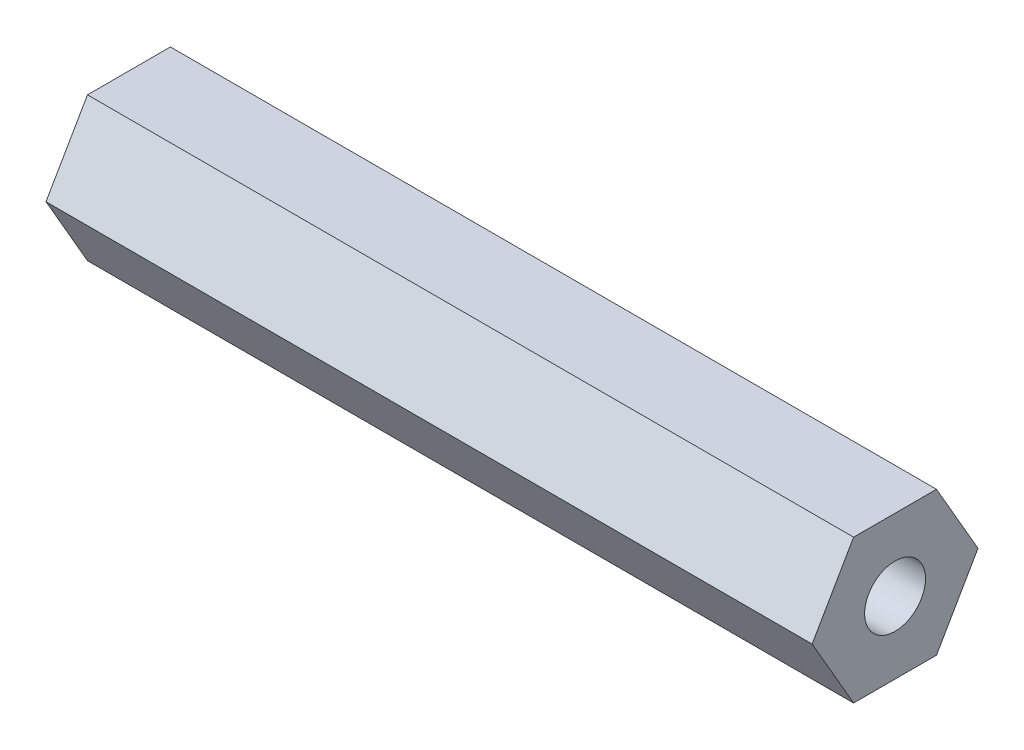
ISO-10303-21;
HEADER;
FILE_DESCRIPTION(('STEP AP214'),'2;1');
FILE_NAME('part.step','',(''),(''),'','','');
FILE_SCHEMA(('AUTOMOTIVE_DESIGN { 1 0 10303 214 1 1 1 1 }'));
ENDSEC;
DATA;
#1=APPLICATION_CONTEXT('core data for automotive mechanical design processes');
#2=APPLICATION_PROTOCOL_DEFINITION('international standard','automotive_design',2000,#1);
#3=PRODUCT_CONTEXT('',#1,'mechanical');
#4=PRODUCT('Part','Part','',(#3));
#5=PRODUCT_RELATED_PRODUCT_CATEGORY('part','',(#4));
#6=PRODUCT_DEFINITION_FORMATION('','',#4);
#7=PRODUCT_DEFINITION_CONTEXT('part definition',#1,'design');
#8=PRODUCT_DEFINITION('design','',#6,#7);
#9=PRODUCT_DEFINITION_SHAPE('','',#8);
#10=(LENGTH_UNIT() NAMED_UNIT(*) SI_UNIT(.MILLI.,.METRE.));
#11=(NAMED_UNIT(*) PLANE_ANGLE_UNIT() SI_UNIT($,.RADIAN.));
#12=(NAMED_UNIT(*) SI_UNIT($,.STERADIAN.) SOLID_ANGLE_UNIT());
#13=UNCERTAINTY_MEASURE_WITH_UNIT(LENGTH_MEASURE(1.E-05),#10,'distance_accuracy_value','');
#14=(GEOMETRIC_REPRESENTATION_CONTEXT(3) GLOBAL_UNCERTAINTY_ASSIGNED_CONTEXT((#13)) GLOBAL_UNIT_ASSIGNED_CONTEXT((#10,
#11,#12)) REPRESENTATION_CONTEXT('',''));
#15=CARTESIAN_POINT('',(0.,0.,0.));
#16=DIRECTION('',(0.,0.,1.));
#17=DIRECTION('',(1.,0.,0.));
#18=AXIS2_PLACEMENT_3D('',#15,#16,#17);
#19=CARTESIAN_POINT('',(38.1,0.,0.));
#20=DIRECTION('',(1.,0.,0.));
#21=DIRECTION('',(0.,1.,0.));
#22=AXIS2_PLACEMENT_3D('',#19,#20,#21);
#23=PLANE('',#22);
#24=CARTESIAN_POINT('',(38.1,0.,0.));
#25=DIRECTION('',(1.,0.,0.));
#26=DIRECTION('',(0.,0.,-1.));
#27=AXIS2_PLACEMENT_3D('',#24,#25,#26);
#28=CIRCLE('',#27,2.0193);
#29=CARTESIAN_POINT('',(38.1,0.,-2.0193));
#30=VERTEX_POINT('',#29);
#31=EDGE_CURVE('E170',#30,#30,#28,.T.);
#32=ORIENTED_EDGE('',*,*,#31,.F.);
#33=EDGE_LOOP('',(#32));
#34=FACE_BOUND('',#33,.T.);
#35=DIRECTION('',(0.,0.866025403784442,-0.5));
#36=VECTOR('',#35,1.);
#37=CARTESIAN_POINT('',(38.1,-4.7625,-2.74963065701564));
#38=LINE('',#37,#36);
#39=CARTESIAN_POINT('',(38.1,-4.7625,-2.74963065701564));
#40=VERTEX_POINT('',#39);
#41=CARTESIAN_POINT('',(38.1,0.,-5.49926131403117));
#42=VERTEX_POINT('',#41);
#43=EDGE_CURVE('E166',#40,#42,#38,.T.);
#44=ORIENTED_EDGE('',*,*,#43,.T.);
#45=DIRECTION('',(0.,0.866025403784438,0.5));
#46=VECTOR('',#45,1.);
#47=CARTESIAN_POINT('',(38.1,0.,-5.49926131403117));
#48=LINE('',#47,#46);
#49=CARTESIAN_POINT('',(38.1,4.7625,-2.74963065701557));
#50=VERTEX_POINT('',#49);
#51=EDGE_CURVE('E101',#42,#50,#48,.T.);
#52=ORIENTED_EDGE('',*,*,#51,.T.);
#53=DIRECTION('',(0.,0.,1.));
#54=VECTOR('',#53,1.);
#55=CARTESIAN_POINT('',(38.1,4.7625,-2.74963065701557));
#56=LINE('',#55,#54);
#57=CARTESIAN_POINT('',(38.1,4.7625,2.7496306570156));
#58=VERTEX_POINT('',#57);
#59=EDGE_CURVE('E143',#50,#58,#56,.T.);
#60=ORIENTED_EDGE('',*,*,#59,.T.);
#61=DIRECTION('',(0.,-0.866025403784442,0.5));
#62=VECTOR('',#61,1.);
#63=CARTESIAN_POINT('',(38.1,4.7625,2.7496306570156));
#64=LINE('',#63,#62);
#65=CARTESIAN_POINT('',(38.1,0.,5.49926131403117));
#66=VERTEX_POINT('',#65);
#67=EDGE_CURVE('E140',#58,#66,#64,.T.);
#68=ORIENTED_EDGE('',*,*,#67,.T.);
#69=DIRECTION('',(0.,-0.866025403784435,-0.500000000000007));
#70=VECTOR('',#69,1.);
#71=CARTESIAN_POINT('',(38.1,0.,5.49926131403117));
#72=LINE('',#71,#70);
#73=CARTESIAN_POINT('',(38.1,-4.7625,2.74963065701554));
#74=VERTEX_POINT('',#73);
#75=EDGE_CURVE('E161',#66,#74,#72,.T.);
#76=ORIENTED_EDGE('',*,*,#75,.T.);
#77=DIRECTION('',(0.,0.,-1.));
#78=VECTOR('',#77,1.);
#79=CARTESIAN_POINT('',(38.1,-4.7625,2.74963065701554));
#80=LINE('',#79,#78);
#81=EDGE_CURVE('E54',#74,#40,#80,.T.);
#82=ORIENTED_EDGE('',*,*,#81,.T.);
#83=EDGE_LOOP('',(#44,#52,#60,#68,#76,#82));
#84=FACE_BOUND('',#83,.T.);
#85=ADVANCED_FACE('F45',(#34,#84),#23,.T.);
#86=CARTESIAN_POINT('',(38.1,-4.7625,2.74963065701554));
#87=DIRECTION('',(0.,1.,0.));
#88=DIRECTION('',(0.,0.,-1.));
#89=AXIS2_PLACEMENT_3D('',#86,#87,#88);
#90=PLANE('',#89);
#91=DIRECTION('',(-1.,0.,0.));
#92=VECTOR('',#91,1.);
#93=CARTESIAN_POINT('',(38.1,-4.7625,2.74963065701554));
#94=LINE('',#93,#92);
#95=CARTESIAN_POINT('',(-12.7,-4.76250000000003,2.74963065701553));
#96=VERTEX_POINT('',#95);
#97=EDGE_CURVE('E158',#74,#96,#94,.T.);
#98=ORIENTED_EDGE('',*,*,#97,.T.);
#99=DIRECTION('',(0.,0.,-1.));
#100=VECTOR('',#99,1.);
#101=CARTESIAN_POINT('',(-12.7,-4.7625,-5.49926131403119));
#102=LINE('',#101,#100);
#103=CARTESIAN_POINT('',(-12.7,-4.76250000000001,-2.74963065701564));
#104=VERTEX_POINT('',#103);
#105=EDGE_CURVE('E136',#96,#104,#102,.T.);
#106=ORIENTED_EDGE('',*,*,#105,.T.);
#107=DIRECTION('',(-1.,0.,0.));
#108=VECTOR('',#107,1.);
#109=CARTESIAN_POINT('',(38.1,-4.7625,-2.74963065701564));
#110=LINE('',#109,#108);
#111=EDGE_CURVE('E157',#40,#104,#110,.T.);
#112=ORIENTED_EDGE('',*,*,#111,.F.);
#113=ORIENTED_EDGE('',*,*,#81,.F.);
#114=EDGE_LOOP('',(#98,#106,#112,#113));
#115=FACE_BOUND('',#114,.T.);
#116=ADVANCED_FACE('F193',(#115),#90,.F.);
#117=CARTESIAN_POINT('',(38.1,0.,5.49926131403117));
#118=DIRECTION('',(0.,0.500000000000007,-0.866025403784435));
#119=DIRECTION('',(-1.,0.,0.));
#120=AXIS2_PLACEMENT_3D('',#117,#118,#119);
#121=PLANE('',#120);
#122=DIRECTION('',(-1.,0.,0.));
#123=VECTOR('',#122,1.);
#124=CARTESIAN_POINT('',(38.1,0.,5.49926131403117));
#125=LINE('',#124,#123);
#126=CARTESIAN_POINT('',(-12.7,0.,5.49926131403117));
#127=VERTEX_POINT('',#126);
#128=EDGE_CURVE('E148',#66,#127,#125,.T.);
#129=ORIENTED_EDGE('',*,*,#128,.T.);
#130=DIRECTION('',(0.,-0.866025403784435,-0.500000000000007));
#131=VECTOR('',#130,1.);
#132=CARTESIAN_POINT('',(-12.7,0.,5.49926131403117));
#133=LINE('',#132,#131);
#134=EDGE_CURVE('E122',#127,#96,#133,.T.);
#135=ORIENTED_EDGE('',*,*,#134,.T.);
#136=ORIENTED_EDGE('',*,*,#97,.F.);
#137=ORIENTED_EDGE('',*,*,#75,.F.);
#138=EDGE_LOOP('',(#129,#135,#136,#137));
#139=FACE_BOUND('',#138,.T.);
#140=ADVANCED_FACE('F47',(#139),#121,.F.);
#141=CARTESIAN_POINT('',(38.1,4.7625,2.7496306570156));
#142=DIRECTION('',(0.,-0.5,-0.866025403784442));
#143=DIRECTION('',(0.,-0.866025403784442,0.5));
#144=AXIS2_PLACEMENT_3D('',#141,#142,#143);
#145=PLANE('',#144);
#146=DIRECTION('',(-1.,0.,0.));
#147=VECTOR('',#146,1.);
#148=CARTESIAN_POINT('',(38.1,4.7625,2.7496306570156));
#149=LINE('',#148,#147);
#150=CARTESIAN_POINT('',(-12.7,4.76249999999998,2.7496306570156));
#151=VERTEX_POINT('',#150);
#152=EDGE_CURVE('E133',#58,#151,#149,.T.);
#153=ORIENTED_EDGE('',*,*,#152,.T.);
#154=DIRECTION('',(0.,-0.866025403784439,0.499999999999999));
#155=VECTOR('',#154,1.);
#156=CARTESIAN_POINT('',(-12.7,4.7625,2.7496306570156));
#157=LINE('',#156,#155);
#158=EDGE_CURVE('E117',#151,#127,#157,.T.);
#159=ORIENTED_EDGE('',*,*,#158,.T.);
#160=ORIENTED_EDGE('',*,*,#128,.F.);
#161=ORIENTED_EDGE('',*,*,#67,.F.);
#162=EDGE_LOOP('',(#153,#159,#160,#161));
#163=FACE_BOUND('',#162,.T.);
#164=ADVANCED_FACE('F138',(#163),#145,.F.);
#165=CARTESIAN_POINT('',(38.1,4.7625,-2.74963065701557));
#166=DIRECTION('',(0.,-1.,0.));
#167=DIRECTION('',(0.,0.,-1.));
#168=AXIS2_PLACEMENT_3D('',#165,#166,#167);
#169=PLANE('',#168);
#170=DIRECTION('',(-1.,0.,0.));
#171=VECTOR('',#170,1.);
#172=CARTESIAN_POINT('',(38.1,4.7625,-2.74963065701557));
#173=LINE('',#172,#171);
#174=CARTESIAN_POINT('',(-12.7,4.7625,-2.74963065701558));
#175=VERTEX_POINT('',#174);
#176=EDGE_CURVE('E134',#50,#175,#173,.T.);
#177=ORIENTED_EDGE('',*,*,#176,.T.);
#178=DIRECTION('',(0.,0.,-1.));
#179=VECTOR('',#178,1.);
#180=CARTESIAN_POINT('',(-12.7,4.76250000000001,-5.49926131403115));
#181=LINE('',#180,#179);
#182=EDGE_CURVE('E120',#151,#175,#181,.T.);
#183=ORIENTED_EDGE('',*,*,#182,.F.);
#184=ORIENTED_EDGE('',*,*,#152,.F.);
#185=ORIENTED_EDGE('',*,*,#59,.F.);
#186=EDGE_LOOP('',(#177,#183,#184,#185));
#187=FACE_BOUND('',#186,.T.);
#188=ADVANCED_FACE('F132',(#187),#169,.F.);
#189=CARTESIAN_POINT('',(38.1,0.,-5.49926131403117));
#190=DIRECTION('',(0.,-0.5,0.866025403784438));
#191=DIRECTION('',(-1.,0.,0.));
#192=AXIS2_PLACEMENT_3D('',#189,#190,#191);
#193=PLANE('',#192);
#194=DIRECTION('',(-1.,0.,0.));
#195=VECTOR('',#194,1.);
#196=CARTESIAN_POINT('',(38.1,0.,-5.49926131403117));
#197=LINE('',#196,#195);
#198=CARTESIAN_POINT('',(-12.7,0.,-5.49926131403117));
#199=VERTEX_POINT('',#198);
#200=EDGE_CURVE('E153',#42,#199,#197,.T.);
#201=ORIENTED_EDGE('',*,*,#200,.T.);
#202=DIRECTION('',(0.,0.866025403784438,0.5));
#203=VECTOR('',#202,1.);
#204=CARTESIAN_POINT('',(-12.7,0.,-5.49926131403117));
#205=LINE('',#204,#203);
#206=EDGE_CURVE('E61',#199,#175,#205,.T.);
#207=ORIENTED_EDGE('',*,*,#206,.T.);
#208=ORIENTED_EDGE('',*,*,#176,.F.);
#209=ORIENTED_EDGE('',*,*,#51,.F.);
#210=EDGE_LOOP('',(#201,#207,#208,#209));
#211=FACE_BOUND('',#210,.T.);
#212=ADVANCED_FACE('F199',(#211),#193,.F.);
#213=CARTESIAN_POINT('',(38.1,-4.7625,-2.74963065701564));
#214=DIRECTION('',(0.,0.5,0.866025403784442));
#215=DIRECTION('',(1.,0.,0.));
#216=AXIS2_PLACEMENT_3D('',#213,#214,#215);
#217=PLANE('',#216);
#218=ORIENTED_EDGE('',*,*,#111,.T.);
#219=DIRECTION('',(0.,0.866025403784439,-0.499999999999999));
#220=VECTOR('',#219,1.);
#221=CARTESIAN_POINT('',(-12.7,-4.7625,-2.74963065701564));
#222=LINE('',#221,#220);
#223=EDGE_CURVE('E191',#104,#199,#222,.T.);
#224=ORIENTED_EDGE('',*,*,#223,.T.);
#225=ORIENTED_EDGE('',*,*,#200,.F.);
#226=ORIENTED_EDGE('',*,*,#43,.F.);
#227=EDGE_LOOP('',(#218,#224,#225,#226));
#228=FACE_BOUND('',#227,.T.);
#229=ADVANCED_FACE('F189',(#228),#217,.F.);
#230=CARTESIAN_POINT('',(-12.7,-4.7625,-5.49926131403119));
#231=DIRECTION('',(1.,0.,0.));
#232=DIRECTION('',(0.,0.,-1.));
#233=AXIS2_PLACEMENT_3D('',#230,#231,#232);
#234=PLANE('',#233);
#235=CARTESIAN_POINT('',(-12.7,0.,0.));
#236=DIRECTION('',(1.,0.,0.));
#237=DIRECTION('',(0.,0.,-1.));
#238=AXIS2_PLACEMENT_3D('',#235,#236,#237);
#239=CIRCLE('',#238,2.0193);
#240=CARTESIAN_POINT('',(-12.7,0.,-2.0193));
#241=VERTEX_POINT('',#240);
#242=EDGE_CURVE('E11',#241,#241,#239,.F.);
#243=ORIENTED_EDGE('',*,*,#242,.F.);
#244=EDGE_LOOP('',(#243));
#245=FACE_BOUND('',#244,.T.);
#246=ORIENTED_EDGE('',*,*,#158,.F.);
#247=ORIENTED_EDGE('',*,*,#182,.T.);
#248=ORIENTED_EDGE('',*,*,#206,.F.);
#249=ORIENTED_EDGE('',*,*,#223,.F.);
#250=ORIENTED_EDGE('',*,*,#105,.F.);
#251=ORIENTED_EDGE('',*,*,#134,.F.);
#252=EDGE_LOOP('',(#246,#247,#248,#249,#250,#251));
#253=FACE_BOUND('',#252,.T.);
#254=ADVANCED_FACE('F119',(#245,#253),#234,.F.);
#255=CARTESIAN_POINT('',(-38.1,0.,0.));
#256=DIRECTION('',(-1.,0.,0.));
#257=DIRECTION('',(0.,0.,1.));
#258=AXIS2_PLACEMENT_3D('',#255,#256,#257);
#259=CYLINDRICAL_SURFACE('',#258,2.0193);
#260=ORIENTED_EDGE('',*,*,#31,.T.);
#261=EDGE_LOOP('',(#260));
#262=FACE_BOUND('',#261,.T.);
#263=ORIENTED_EDGE('',*,*,#242,.T.);
#264=EDGE_LOOP('',(#263));
#265=FACE_BOUND('',#264,.T.);
#266=ADVANCED_FACE('F219',(#262,#265),#259,.F.);
#267=CLOSED_SHELL('',(#85,#116,#140,#164,#188,#212,#229,#254,#266));
#268=MANIFOLD_SOLID_BREP('B2',#267);
#269=ADVANCED_BREP_SHAPE_REPRESENTATION('',(#18,#268),#14);
#270=SHAPE_DEFINITION_REPRESENTATION(#9,#269);
ENDSEC;
END-ISO-10303-21;
